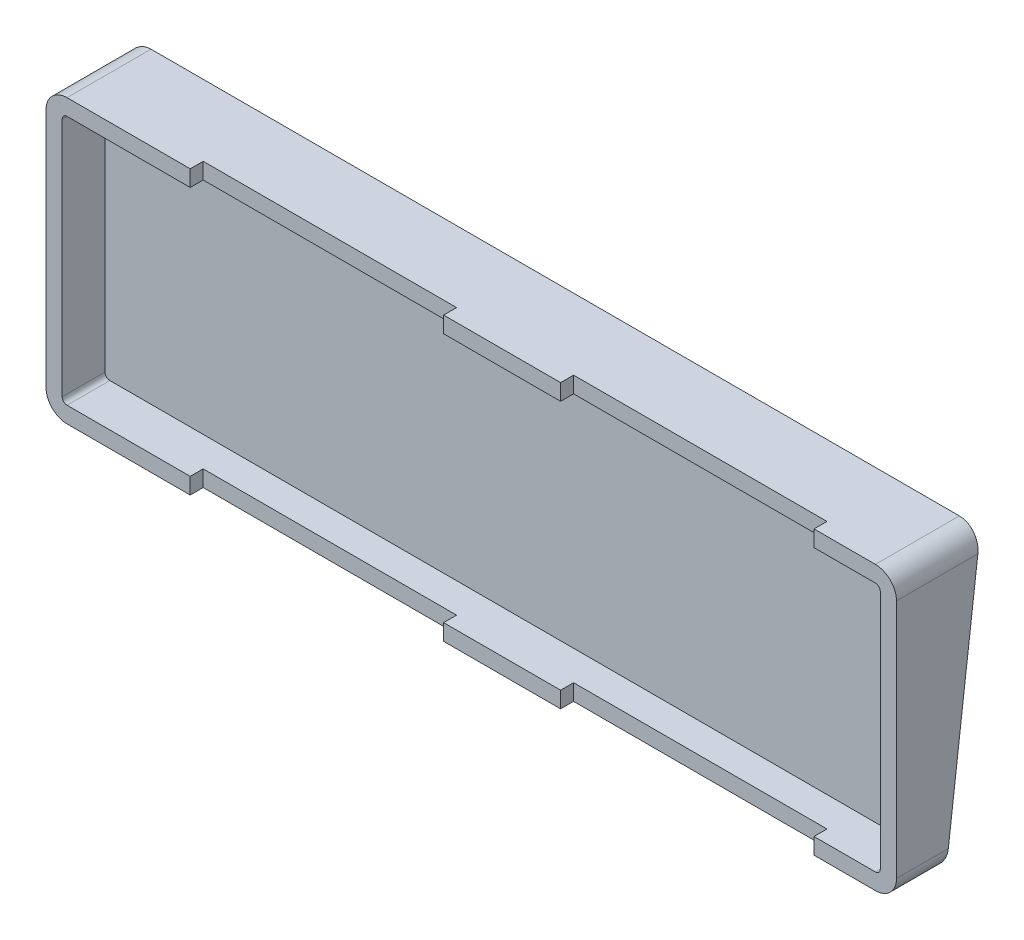
ISO-10303-21;
HEADER;
FILE_DESCRIPTION(('STEP AP214'),'2;1');
FILE_NAME('part.step','',(''),(''),'','','');
FILE_SCHEMA(('AUTOMOTIVE_DESIGN { 1 0 10303 214 1 1 1 1 }'));
ENDSEC;
DATA;
#1=APPLICATION_CONTEXT('core data for automotive mechanical design processes');
#2=APPLICATION_PROTOCOL_DEFINITION('international standard','automotive_design',2000,#1);
#3=PRODUCT_CONTEXT('',#1,'mechanical');
#4=PRODUCT('Part','Part','',(#3));
#5=PRODUCT_RELATED_PRODUCT_CATEGORY('part','',(#4));
#6=PRODUCT_DEFINITION_FORMATION('','',#4);
#7=PRODUCT_DEFINITION_CONTEXT('part definition',#1,'design');
#8=PRODUCT_DEFINITION('design','',#6,#7);
#9=PRODUCT_DEFINITION_SHAPE('','',#8);
#10=(LENGTH_UNIT() NAMED_UNIT(*) SI_UNIT(.MILLI.,.METRE.));
#11=(NAMED_UNIT(*) PLANE_ANGLE_UNIT() SI_UNIT($,.RADIAN.));
#12=(NAMED_UNIT(*) SI_UNIT($,.STERADIAN.) SOLID_ANGLE_UNIT());
#13=UNCERTAINTY_MEASURE_WITH_UNIT(LENGTH_MEASURE(1.E-05),#10,'distance_accuracy_value','');
#14=(GEOMETRIC_REPRESENTATION_CONTEXT(3) GLOBAL_UNCERTAINTY_ASSIGNED_CONTEXT((#13)) GLOBAL_UNIT_ASSIGNED_CONTEXT((#10,
#11,#12)) REPRESENTATION_CONTEXT('',''));
#15=CARTESIAN_POINT('',(0.,0.,0.));
#16=DIRECTION('',(0.,0.,1.));
#17=DIRECTION('',(1.,0.,0.));
#18=AXIS2_PLACEMENT_3D('',#15,#16,#17);
#19=CARTESIAN_POINT('',(280.772500000017,-126.634997509999,282.586613314107));
#20=DIRECTION('',(-1.,-2.28927396857067E-13,0.));
#21=DIRECTION('',(2.28927396857067E-13,-1.,0.));
#22=AXIS2_PLACEMENT_3D('',#19,#20,#21);
#23=PLANE('',#22);
#24=DIRECTION('',(2.27221006755748E-13,-0.992546151641322,0.121869343405148));
#25=VECTOR('',#24,1.);
#26=CARTESIAN_POINT('',(280.772500000025,-162.024507324144,-5.63781452849937));
#27=LINE('',#26,#25);
#28=CARTESIAN_POINT('',(280.7725,-52.435,-19.0937140648601));
#29=VERTEX_POINT('',#28);
#30=CARTESIAN_POINT('',(280.772500000026,-126.634997509999,-9.98309995159829));
#31=VERTEX_POINT('',#30);
#32=EDGE_CURVE('E275',#29,#31,#27,.T.);
#33=ORIENTED_EDGE('',*,*,#32,.F.);
#34=DIRECTION('',(0.,0.,-1.));
#35=VECTOR('',#34,1.);
#36=CARTESIAN_POINT('',(280.7725,-52.435,282.586613314107));
#37=LINE('',#36,#35);
#38=CARTESIAN_POINT('',(280.7725,-52.435,6.02000000000003));
#39=VERTEX_POINT('',#38);
#40=EDGE_CURVE('E262',#39,#29,#37,.T.);
#41=ORIENTED_EDGE('',*,*,#40,.F.);
#42=DIRECTION('',(-2.28927396857067E-13,1.,0.));
#43=VECTOR('',#42,1.);
#44=CARTESIAN_POINT('',(280.772500000017,-126.634997509999,6.02000000000003));
#45=LINE('',#44,#43);
#46=CARTESIAN_POINT('',(280.772500000026,-126.634997509999,6.02000000000003));
#47=VERTEX_POINT('',#46);
#48=EDGE_CURVE('E450',#47,#39,#45,.T.);
#49=ORIENTED_EDGE('',*,*,#48,.F.);
#50=DIRECTION('',(0.,0.,-1.));
#51=VECTOR('',#50,1.);
#52=CARTESIAN_POINT('',(280.772500000026,-126.634997509999,282.586613314107));
#53=LINE('',#52,#51);
#54=EDGE_CURVE('E271',#47,#31,#53,.T.);
#55=ORIENTED_EDGE('',*,*,#54,.T.);
#56=EDGE_LOOP('',(#33,#41,#49,#55));
#57=FACE_BOUND('',#56,.T.);
#58=ADVANCED_FACE('F50',(#57),#23,.F.);
#59=CARTESIAN_POINT('',(274.27250074707,-126.635000747,282.586613314107));
#60=DIRECTION('',(0.,0.,-1.));
#61=DIRECTION('',(-1.,0.,0.));
#62=AXIS2_PLACEMENT_3D('',#59,#60,#61);
#63=CYLINDRICAL_SURFACE('',#62,6.49999925295641);
#64=CARTESIAN_POINT('',(274.27250074707,-126.635000747,-9.98309955414456));
#65=DIRECTION('',(0.,-0.121869343405148,-0.992546151641322));
#66=DIRECTION('',(0.,0.992546151641322,-0.121869343405148));
#67=AXIS2_PLACEMENT_3D('',#64,#65,#66);
#68=ELLIPSE('',#67,6.54881311282875,6.49999925295641);
#69=CARTESIAN_POINT('',(274.2725,-133.134999999965,-9.18499999999939));
#70=VERTEX_POINT('',#69);
#71=EDGE_CURVE('E65',#31,#70,#68,.T.);
#72=ORIENTED_EDGE('',*,*,#71,.F.);
#73=ORIENTED_EDGE('',*,*,#54,.F.);
#74=CARTESIAN_POINT('',(274.27250074707,-126.635000747,6.02000000000003));
#75=DIRECTION('',(0.,0.,1.));
#76=DIRECTION('',(1.,0.,0.));
#77=AXIS2_PLACEMENT_3D('',#74,#75,#76);
#78=CIRCLE('',#77,6.49999925295641);
#79=CARTESIAN_POINT('',(274.2725,-133.134999999965,6.02000000000003));
#80=VERTEX_POINT('',#79);
#81=EDGE_CURVE('E452',#80,#47,#78,.T.);
#82=ORIENTED_EDGE('',*,*,#81,.F.);
#83=DIRECTION('',(0.,0.,-1.));
#84=VECTOR('',#83,1.);
#85=CARTESIAN_POINT('',(274.2725,-133.134999999965,282.586613314107));
#86=LINE('',#85,#84);
#87=EDGE_CURVE('E499',#80,#70,#86,.T.);
#88=ORIENTED_EDGE('',*,*,#87,.T.);
#89=EDGE_LOOP('',(#72,#73,#82,#88));
#90=FACE_BOUND('',#89,.T.);
#91=ADVANCED_FACE('F586',(#90),#63,.T.);
#92=CARTESIAN_POINT('',(24.8125041089156,-133.13499999998,282.586613314107));
#93=DIRECTION('',(0.,1.,0.));
#94=DIRECTION('',(-1.,0.,0.));
#95=AXIS2_PLACEMENT_3D('',#92,#93,#94);
#96=PLANE('',#95);
#97=DIRECTION('',(-1.,0.,0.));
#98=VECTOR('',#97,1.);
#99=CARTESIAN_POINT('',(24.8125041089142,-133.13499999998,-9.18499999999883));
#100=LINE('',#99,#98);
#101=CARTESIAN_POINT('',(24.8125041089156,-133.13499999997,-9.185));
#102=VERTEX_POINT('',#101);
#103=EDGE_CURVE('E73',#70,#102,#100,.T.);
#104=ORIENTED_EDGE('',*,*,#103,.F.);
#105=ORIENTED_EDGE('',*,*,#87,.F.);
#106=DIRECTION('',(1.,0.,0.));
#107=VECTOR('',#106,1.);
#108=CARTESIAN_POINT('',(24.8125041089156,-133.13499999998,6.02000000000003));
#109=LINE('',#108,#107);
#110=CARTESIAN_POINT('',(255.3175,-133.134999999966,6.02000000000003));
#111=VERTEX_POINT('',#110);
#112=EDGE_CURVE('E455',#111,#80,#109,.T.);
#113=ORIENTED_EDGE('',*,*,#112,.F.);
#114=DIRECTION('',(0.,0.,1.));
#115=VECTOR('',#114,1.);
#116=CARTESIAN_POINT('',(255.3175,-133.13499999997,2.02));
#117=LINE('',#116,#115);
#118=CARTESIAN_POINT('',(255.3175,-133.13499999997,2.02));
#119=VERTEX_POINT('',#118);
#120=EDGE_CURVE('E350',#119,#111,#117,.T.);
#121=ORIENTED_EDGE('',*,*,#120,.F.);
#122=DIRECTION('',(1.,0.,0.));
#123=VECTOR('',#122,1.);
#124=CARTESIAN_POINT('',(177.1175,-133.13499999997,2.02));
#125=LINE('',#124,#123);
#126=CARTESIAN_POINT('',(177.1175,-133.13499999997,2.02));
#127=VERTEX_POINT('',#126);
#128=EDGE_CURVE('E369',#127,#119,#125,.T.);
#129=ORIENTED_EDGE('',*,*,#128,.F.);
#130=DIRECTION('',(0.,0.,1.));
#131=VECTOR('',#130,1.);
#132=CARTESIAN_POINT('',(177.1175,-133.13499999997,2.02));
#133=LINE('',#132,#131);
#134=CARTESIAN_POINT('',(177.1175,-133.13499999997,6.02));
#135=VERTEX_POINT('',#134);
#136=EDGE_CURVE('E346',#127,#135,#133,.T.);
#137=ORIENTED_EDGE('',*,*,#136,.T.);
#138=CARTESIAN_POINT('',(141.0175,-133.134999999973,6.02000000000003));
#139=VERTEX_POINT('',#138);
#140=EDGE_CURVE('E460',#139,#135,#109,.T.);
#141=ORIENTED_EDGE('',*,*,#140,.F.);
#142=DIRECTION('',(0.,0.,1.));
#143=VECTOR('',#142,1.);
#144=CARTESIAN_POINT('',(141.0175,-133.13499999997,2.02));
#145=LINE('',#144,#143);
#146=CARTESIAN_POINT('',(141.0175,-133.13499999997,2.02));
#147=VERTEX_POINT('',#146);
#148=EDGE_CURVE('E424',#147,#139,#145,.T.);
#149=ORIENTED_EDGE('',*,*,#148,.F.);
#150=DIRECTION('',(1.,0.,0.));
#151=VECTOR('',#150,1.);
#152=CARTESIAN_POINT('',(62.8175,-133.13499999997,2.02));
#153=LINE('',#152,#151);
#154=CARTESIAN_POINT('',(62.8175,-133.13499999997,2.02));
#155=VERTEX_POINT('',#154);
#156=EDGE_CURVE('E405',#155,#147,#153,.T.);
#157=ORIENTED_EDGE('',*,*,#156,.F.);
#158=DIRECTION('',(0.,0.,1.));
#159=VECTOR('',#158,1.);
#160=CARTESIAN_POINT('',(62.8175,-133.13499999997,2.02));
#161=LINE('',#160,#159);
#162=CARTESIAN_POINT('',(62.8175,-133.13499999997,6.02));
#163=VERTEX_POINT('',#162);
#164=EDGE_CURVE('E415',#155,#163,#161,.T.);
#165=ORIENTED_EDGE('',*,*,#164,.T.);
#166=CARTESIAN_POINT('',(24.8125041089156,-133.13499999997,6.02000000000003));
#167=VERTEX_POINT('',#166);
#168=EDGE_CURVE('E456',#167,#163,#109,.T.);
#169=ORIENTED_EDGE('',*,*,#168,.F.);
#170=DIRECTION('',(0.,0.,-1.));
#171=VECTOR('',#170,1.);
#172=CARTESIAN_POINT('',(24.8125041089156,-133.13499999997,282.586613314107));
#173=LINE('',#172,#171);
#174=EDGE_CURVE('E501',#167,#102,#173,.T.);
#175=ORIENTED_EDGE('',*,*,#174,.T.);
#176=EDGE_LOOP('',(#104,#105,#113,#121,#129,#137,#141,#149,#157,#165,#169,#175));
#177=FACE_BOUND('',#176,.T.);
#178=ADVANCED_FACE('F561',(#177),#96,.F.);
#179=CARTESIAN_POINT('',(24.812499252925,-126.635000747,282.586613314107));
#180=DIRECTION('',(0.,0.,-1.));
#181=DIRECTION('',(-1.,0.,0.));
#182=AXIS2_PLACEMENT_3D('',#179,#180,#181);
#183=CYLINDRICAL_SURFACE('',#182,6.49999925297202);
#184=CARTESIAN_POINT('',(24.812499252925,-126.635000747,-9.98309955414517));
#185=DIRECTION('',(0.,-0.121869343405148,-0.992546151641322));
#186=DIRECTION('',(0.,0.992546151641322,-0.121869343405148));
#187=AXIS2_PLACEMENT_3D('',#184,#185,#186);
#188=ELLIPSE('',#187,6.54881311284448,6.49999925297202);
#189=CARTESIAN_POINT('',(18.3124999999625,-126.635,-9.98309964586519));
#190=VERTEX_POINT('',#189);
#191=EDGE_CURVE('E293',#102,#190,#188,.T.);
#192=ORIENTED_EDGE('',*,*,#191,.F.);
#193=ORIENTED_EDGE('',*,*,#174,.F.);
#194=CARTESIAN_POINT('',(24.812499252925,-126.635000747,6.02000000000003));
#195=DIRECTION('',(0.,0.,1.));
#196=DIRECTION('',(1.,0.,0.));
#197=AXIS2_PLACEMENT_3D('',#194,#195,#196);
#198=CIRCLE('',#197,6.49999925297202);
#199=CARTESIAN_POINT('',(18.3124999999625,-126.635,6.02000000000003));
#200=VERTEX_POINT('',#199);
#201=EDGE_CURVE('E459',#200,#167,#198,.T.);
#202=ORIENTED_EDGE('',*,*,#201,.F.);
#203=DIRECTION('',(0.,0.,-1.));
#204=VECTOR('',#203,1.);
#205=CARTESIAN_POINT('',(18.3124999999625,-126.635,282.586613314107));
#206=LINE('',#205,#204);
#207=EDGE_CURVE('E503',#200,#190,#206,.T.);
#208=ORIENTED_EDGE('',*,*,#207,.T.);
#209=EDGE_LOOP('',(#192,#193,#202,#208));
#210=FACE_BOUND('',#209,.T.);
#211=ADVANCED_FACE('F588',(#210),#183,.T.);
#212=CARTESIAN_POINT('',(18.312500000004,-52.4350041089431,282.586613314107));
#213=DIRECTION('',(1.,-5.59834105876915E-13,0.));
#214=DIRECTION('',(5.59834105876915E-13,1.,0.));
#215=AXIS2_PLACEMENT_3D('',#212,#213,#214);
#216=PLANE('',#215);
#217=DIRECTION('',(5.55661187345693E-13,0.992546151641322,-0.121869343405148));
#218=VECTOR('',#217,1.);
#219=CARTESIAN_POINT('',(18.3124999999836,-88.9265423802406,-14.6131160570331));
#220=LINE('',#219,#218);
#221=CARTESIAN_POINT('',(18.3125000000054,-52.4350041089431,-19.093713560346));
#222=VERTEX_POINT('',#221);
#223=EDGE_CURVE('E289',#190,#222,#220,.T.);
#224=ORIENTED_EDGE('',*,*,#223,.F.);
#225=ORIENTED_EDGE('',*,*,#207,.F.);
#226=DIRECTION('',(-5.59834105876915E-13,-1.,0.));
#227=VECTOR('',#226,1.);
#228=CARTESIAN_POINT('',(18.312500000004,-52.4350041089431,6.02000000000003));
#229=LINE('',#228,#227);
#230=CARTESIAN_POINT('',(18.3125000000054,-52.4350041089431,6.02000000000003));
#231=VERTEX_POINT('',#230);
#232=EDGE_CURVE('E463',#231,#200,#229,.T.);
#233=ORIENTED_EDGE('',*,*,#232,.F.);
#234=DIRECTION('',(0.,0.,-1.));
#235=VECTOR('',#234,1.);
#236=CARTESIAN_POINT('',(18.3125000000054,-52.4350041089431,282.586613314107));
#237=LINE('',#236,#235);
#238=EDGE_CURVE('E506',#231,#222,#237,.T.);
#239=ORIENTED_EDGE('',*,*,#238,.T.);
#240=EDGE_LOOP('',(#224,#225,#233,#239));
#241=FACE_BOUND('',#240,.T.);
#242=ADVANCED_FACE('F591',(#241),#216,.F.);
#243=CARTESIAN_POINT('',(24.812499252925,-52.43499925292,282.586613314107));
#244=DIRECTION('',(0.,0.,-1.));
#245=DIRECTION('',(-1.,0.,0.));
#246=AXIS2_PLACEMENT_3D('',#243,#244,#245);
#247=CYLINDRICAL_SURFACE('',#246,6.49999925292141);
#248=CARTESIAN_POINT('',(24.812499252925,-52.43499925292,-19.0937141565906));
#249=DIRECTION('',(0.,-0.121869343405148,-0.992546151641322));
#250=DIRECTION('',(0.,0.992546151641322,-0.121869343405148));
#251=AXIS2_PLACEMENT_3D('',#248,#249,#250);
#252=ELLIPSE('',#251,6.54881311279349,6.49999925292141);
#253=CARTESIAN_POINT('',(24.8125,-45.935,-19.8918137107293));
#254=VERTEX_POINT('',#253);
#255=EDGE_CURVE('E284',#222,#254,#252,.T.);
#256=ORIENTED_EDGE('',*,*,#255,.F.);
#257=ORIENTED_EDGE('',*,*,#238,.F.);
#258=CARTESIAN_POINT('',(24.812499252925,-52.43499925292,6.02000000000003));
#259=DIRECTION('',(0.,0.,1.));
#260=DIRECTION('',(1.,0.,0.));
#261=AXIS2_PLACEMENT_3D('',#258,#259,#260);
#262=CIRCLE('',#261,6.49999925292141);
#263=CARTESIAN_POINT('',(24.8125,-45.935,6.02000000000003));
#264=VERTEX_POINT('',#263);
#265=EDGE_CURVE('E466',#264,#231,#262,.T.);
#266=ORIENTED_EDGE('',*,*,#265,.F.);
#267=DIRECTION('',(0.,0.,-1.));
#268=VECTOR('',#267,1.);
#269=CARTESIAN_POINT('',(24.8125,-45.935,282.586613314107));
#270=LINE('',#269,#268);
#271=EDGE_CURVE('E509',#264,#254,#270,.T.);
#272=ORIENTED_EDGE('',*,*,#271,.T.);
#273=EDGE_LOOP('',(#256,#257,#266,#272));
#274=FACE_BOUND('',#273,.T.);
#275=ADVANCED_FACE('F596',(#274),#247,.T.);
#276=CARTESIAN_POINT('',(274.272499626465,-45.935,282.586613314107));
#277=DIRECTION('',(0.,-1.,0.));
#278=DIRECTION('',(1.,0.,0.));
#279=AXIS2_PLACEMENT_3D('',#276,#277,#278);
#280=PLANE('',#279);
#281=DIRECTION('',(1.,0.,0.));
#282=VECTOR('',#281,1.);
#283=CARTESIAN_POINT('',(274.272499626465,-45.935,-19.891813710729));
#284=LINE('',#283,#282);
#285=CARTESIAN_POINT('',(274.272499626465,-45.935,-19.891813710729));
#286=VERTEX_POINT('',#285);
#287=EDGE_CURVE('E282',#254,#286,#284,.T.);
#288=ORIENTED_EDGE('',*,*,#287,.F.);
#289=ORIENTED_EDGE('',*,*,#271,.F.);
#290=DIRECTION('',(-1.,0.,0.));
#291=VECTOR('',#290,1.);
#292=CARTESIAN_POINT('',(274.272499626465,-45.935,6.02000000000003));
#293=LINE('',#292,#291);
#294=CARTESIAN_POINT('',(62.8175,-45.935,6.02));
#295=VERTEX_POINT('',#294);
#296=EDGE_CURVE('E469',#295,#264,#293,.T.);
#297=ORIENTED_EDGE('',*,*,#296,.F.);
#298=DIRECTION('',(0.,0.,1.));
#299=VECTOR('',#298,1.);
#300=CARTESIAN_POINT('',(62.8175,-45.935,2.02));
#301=LINE('',#300,#299);
#302=CARTESIAN_POINT('',(62.8175,-45.935,2.02));
#303=VERTEX_POINT('',#302);
#304=EDGE_CURVE('E335',#303,#295,#301,.T.);
#305=ORIENTED_EDGE('',*,*,#304,.F.);
#306=DIRECTION('',(-1.,0.,0.));
#307=VECTOR('',#306,1.);
#308=CARTESIAN_POINT('',(62.8175,-45.935,2.02));
#309=LINE('',#308,#307);
#310=CARTESIAN_POINT('',(141.0175,-45.935,2.02));
#311=VERTEX_POINT('',#310);
#312=EDGE_CURVE('E377',#311,#303,#309,.T.);
#313=ORIENTED_EDGE('',*,*,#312,.F.);
#314=DIRECTION('',(0.,0.,1.));
#315=VECTOR('',#314,1.);
#316=CARTESIAN_POINT('',(141.0175,-45.935,2.02));
#317=LINE('',#316,#315);
#318=CARTESIAN_POINT('',(141.0175,-45.935,6.02));
#319=VERTEX_POINT('',#318);
#320=EDGE_CURVE('E381',#311,#319,#317,.T.);
#321=ORIENTED_EDGE('',*,*,#320,.T.);
#322=CARTESIAN_POINT('',(177.1175,-45.935,6.02));
#323=VERTEX_POINT('',#322);
#324=EDGE_CURVE('E473',#323,#319,#293,.T.);
#325=ORIENTED_EDGE('',*,*,#324,.F.);
#326=DIRECTION('',(0.,0.,1.));
#327=VECTOR('',#326,1.);
#328=CARTESIAN_POINT('',(177.1175,-45.935,2.02));
#329=LINE('',#328,#327);
#330=CARTESIAN_POINT('',(177.1175,-45.935,2.02));
#331=VERTEX_POINT('',#330);
#332=EDGE_CURVE('E319',#331,#323,#329,.T.);
#333=ORIENTED_EDGE('',*,*,#332,.F.);
#334=DIRECTION('',(-1.,0.,0.));
#335=VECTOR('',#334,1.);
#336=CARTESIAN_POINT('',(177.1175,-45.935,2.02));
#337=LINE('',#336,#335);
#338=CARTESIAN_POINT('',(255.3175,-45.935,2.02));
#339=VERTEX_POINT('',#338);
#340=EDGE_CURVE('E323',#339,#331,#337,.T.);
#341=ORIENTED_EDGE('',*,*,#340,.F.);
#342=DIRECTION('',(0.,0.,1.));
#343=VECTOR('',#342,1.);
#344=CARTESIAN_POINT('',(255.3175,-45.935,2.02));
#345=LINE('',#344,#343);
#346=CARTESIAN_POINT('',(255.3175,-45.935,6.02));
#347=VERTEX_POINT('',#346);
#348=EDGE_CURVE('E326',#339,#347,#345,.T.);
#349=ORIENTED_EDGE('',*,*,#348,.T.);
#350=CARTESIAN_POINT('',(274.272499626465,-45.935,6.02000000000003));
#351=VERTEX_POINT('',#350);
#352=EDGE_CURVE('E470',#351,#347,#293,.T.);
#353=ORIENTED_EDGE('',*,*,#352,.F.);
#354=DIRECTION('',(0.,0.,-1.));
#355=VECTOR('',#354,1.);
#356=CARTESIAN_POINT('',(274.272499626465,-45.935,282.586613314107));
#357=LINE('',#356,#355);
#358=EDGE_CURVE('E511',#351,#286,#357,.T.);
#359=ORIENTED_EDGE('',*,*,#358,.T.);
#360=EDGE_LOOP('',(#288,#289,#297,#305,#313,#321,#325,#333,#341,#349,#353,#359));
#361=FACE_BOUND('',#360,.T.);
#362=ADVANCED_FACE('F597',(#361),#280,.F.);
#363=CARTESIAN_POINT('',(274.27250074707,-52.43499925292,282.586613314107));
#364=DIRECTION('',(0.,0.,-1.));
#365=DIRECTION('',(-1.,0.,0.));
#366=AXIS2_PLACEMENT_3D('',#363,#364,#365);
#367=CYLINDRICAL_SURFACE('',#366,6.49999925292508);
#368=CARTESIAN_POINT('',(274.27250074707,-52.43499925292,-19.09371415659));
#369=DIRECTION('',(0.,-0.121869343405148,-0.992546151641322));
#370=DIRECTION('',(0.,0.992546151641322,-0.121869343405148));
#371=AXIS2_PLACEMENT_3D('',#368,#369,#370);
#372=ELLIPSE('',#371,6.5488131127972,6.49999925292508);
#373=EDGE_CURVE('E13',#286,#29,#372,.T.);
#374=ORIENTED_EDGE('',*,*,#373,.F.);
#375=ORIENTED_EDGE('',*,*,#358,.F.);
#376=CARTESIAN_POINT('',(274.27250074707,-52.43499925292,6.02000000000003));
#377=DIRECTION('',(0.,0.,1.));
#378=DIRECTION('',(1.,0.,0.));
#379=AXIS2_PLACEMENT_3D('',#376,#377,#378);
#380=CIRCLE('',#379,6.49999925292508);
#381=EDGE_CURVE('E267',#39,#351,#380,.T.);
#382=ORIENTED_EDGE('',*,*,#381,.F.);
#383=ORIENTED_EDGE('',*,*,#40,.T.);
#384=EDGE_LOOP('',(#374,#375,#382,#383));
#385=FACE_BOUND('',#384,.T.);
#386=ADVANCED_FACE('F52',(#385),#367,.T.);
#387=CARTESIAN_POINT('',(24.8125003735378,-128.134999999981,282.586613314107));
#388=DIRECTION('',(0.,1.,0.));
#389=DIRECTION('',(-1.,0.,0.));
#390=AXIS2_PLACEMENT_3D('',#387,#388,#389);
#391=PLANE('',#390);
#392=DIRECTION('',(0.,0.,-1.));
#393=VECTOR('',#392,1.);
#394=CARTESIAN_POINT('',(274.2725,-128.134999999965,282.586613314107));
#395=LINE('',#394,#393);
#396=CARTESIAN_POINT('',(274.2725,-128.134999999965,6.02000000000003));
#397=VERTEX_POINT('',#396);
#398=CARTESIAN_POINT('',(274.2725,-128.134999999965,-7.185));
#399=VERTEX_POINT('',#398);
#400=EDGE_CURVE('E475',#397,#399,#395,.T.);
#401=ORIENTED_EDGE('',*,*,#400,.T.);
#402=DIRECTION('',(-1.,0.,0.));
#403=VECTOR('',#402,1.);
#404=CARTESIAN_POINT('',(24.8125003735378,-128.134999999981,-7.185));
#405=LINE('',#404,#403);
#406=CARTESIAN_POINT('',(24.8125003735378,-128.134999999972,-7.185));
#407=VERTEX_POINT('',#406);
#408=EDGE_CURVE('E316',#399,#407,#405,.T.);
#409=ORIENTED_EDGE('',*,*,#408,.T.);
#410=DIRECTION('',(0.,0.,-1.));
#411=VECTOR('',#410,1.);
#412=CARTESIAN_POINT('',(24.8125003735378,-128.134999999972,282.586613314107));
#413=LINE('',#412,#411);
#414=CARTESIAN_POINT('',(24.8125003735378,-128.134999999981,6.02000000000003));
#415=VERTEX_POINT('',#414);
#416=EDGE_CURVE('E478',#415,#407,#413,.T.);
#417=ORIENTED_EDGE('',*,*,#416,.F.);
#418=DIRECTION('',(1.,0.,0.));
#419=VECTOR('',#418,1.);
#420=CARTESIAN_POINT('',(24.8125003735378,-128.134999999981,6.02000000000003));
#421=LINE('',#420,#419);
#422=CARTESIAN_POINT('',(62.8175,-128.134999999981,6.02));
#423=VERTEX_POINT('',#422);
#424=EDGE_CURVE('E514',#415,#423,#421,.T.);
#425=ORIENTED_EDGE('',*,*,#424,.T.);
#426=DIRECTION('',(0.,0.,1.));
#427=VECTOR('',#426,1.);
#428=CARTESIAN_POINT('',(62.8175,-128.134999999981,2.02));
#429=LINE('',#428,#427);
#430=CARTESIAN_POINT('',(62.8175,-128.134999999981,2.02));
#431=VERTEX_POINT('',#430);
#432=EDGE_CURVE('E418',#431,#423,#429,.T.);
#433=ORIENTED_EDGE('',*,*,#432,.F.);
#434=DIRECTION('',(-1.,0.,0.));
#435=VECTOR('',#434,1.);
#436=CARTESIAN_POINT('',(62.8175,-128.134999999981,2.02));
#437=LINE('',#436,#435);
#438=CARTESIAN_POINT('',(141.0175,-128.134999999981,2.02));
#439=VERTEX_POINT('',#438);
#440=EDGE_CURVE('E412',#439,#431,#437,.T.);
#441=ORIENTED_EDGE('',*,*,#440,.F.);
#442=DIRECTION('',(0.,0.,1.));
#443=VECTOR('',#442,1.);
#444=CARTESIAN_POINT('',(141.0175,-128.134999999981,2.02));
#445=LINE('',#444,#443);
#446=CARTESIAN_POINT('',(141.0175,-128.134999999981,6.02));
#447=VERTEX_POINT('',#446);
#448=EDGE_CURVE('E421',#439,#447,#445,.T.);
#449=ORIENTED_EDGE('',*,*,#448,.T.);
#450=CARTESIAN_POINT('',(177.1175,-128.134999999981,6.02));
#451=VERTEX_POINT('',#450);
#452=EDGE_CURVE('E516',#447,#451,#421,.T.);
#453=ORIENTED_EDGE('',*,*,#452,.T.);
#454=DIRECTION('',(0.,0.,1.));
#455=VECTOR('',#454,1.);
#456=CARTESIAN_POINT('',(177.1175,-128.134999999981,2.02));
#457=LINE('',#456,#455);
#458=CARTESIAN_POINT('',(177.1175,-128.134999999981,2.02));
#459=VERTEX_POINT('',#458);
#460=EDGE_CURVE('E355',#459,#451,#457,.T.);
#461=ORIENTED_EDGE('',*,*,#460,.F.);
#462=DIRECTION('',(-1.,0.,0.));
#463=VECTOR('',#462,1.);
#464=CARTESIAN_POINT('',(177.1175,-128.134999999981,2.02));
#465=LINE('',#464,#463);
#466=CARTESIAN_POINT('',(255.3175,-128.134999999981,2.02));
#467=VERTEX_POINT('',#466);
#468=EDGE_CURVE('E349',#467,#459,#465,.T.);
#469=ORIENTED_EDGE('',*,*,#468,.F.);
#470=DIRECTION('',(0.,0.,1.));
#471=VECTOR('',#470,1.);
#472=CARTESIAN_POINT('',(255.3175,-128.134999999981,2.02));
#473=LINE('',#472,#471);
#474=CARTESIAN_POINT('',(255.3175,-128.134999999981,6.02));
#475=VERTEX_POINT('',#474);
#476=EDGE_CURVE('E352',#467,#475,#473,.T.);
#477=ORIENTED_EDGE('',*,*,#476,.T.);
#478=EDGE_CURVE('E513',#475,#397,#421,.T.);
#479=ORIENTED_EDGE('',*,*,#478,.T.);
#480=EDGE_LOOP('',(#401,#409,#417,#425,#433,#441,#449,#453,#461,#469,#477,#479));
#481=FACE_BOUND('',#480,.T.);
#482=ADVANCED_FACE('F524',(#481),#391,.T.);
#483=CARTESIAN_POINT('',(24.812499252925,-126.635000747,282.586613314107));
#484=DIRECTION('',(0.,0.,-1.));
#485=DIRECTION('',(-1.,0.,0.));
#486=AXIS2_PLACEMENT_3D('',#483,#484,#485);
#487=CYLINDRICAL_SURFACE('',#486,1.49999925297211);
#488=ORIENTED_EDGE('',*,*,#416,.T.);
#489=CARTESIAN_POINT('',(24.812499252925,-126.635000747,-7.185));
#490=DIRECTION('',(0.,0.,-1.));
#491=DIRECTION('',(0.,1.,0.));
#492=AXIS2_PLACEMENT_3D('',#489,#490,#491);
#493=CIRCLE('',#492,1.49999925297211);
#494=CARTESIAN_POINT('',(23.3124999999625,-126.635,-7.185));
#495=VERTEX_POINT('',#494);
#496=EDGE_CURVE('E313',#407,#495,#493,.T.);
#497=ORIENTED_EDGE('',*,*,#496,.T.);
#498=DIRECTION('',(0.,0.,-1.));
#499=VECTOR('',#498,1.);
#500=CARTESIAN_POINT('',(23.3124999999625,-126.635,282.586613314107));
#501=LINE('',#500,#499);
#502=CARTESIAN_POINT('',(23.3124999999531,-126.635,6.02000000000003));
#503=VERTEX_POINT('',#502);
#504=EDGE_CURVE('E481',#503,#495,#501,.T.);
#505=ORIENTED_EDGE('',*,*,#504,.F.);
#506=CARTESIAN_POINT('',(24.812499252925,-126.635000747,6.02000000000003));
#507=DIRECTION('',(0.,0.,1.));
#508=DIRECTION('',(1.,0.,0.));
#509=AXIS2_PLACEMENT_3D('',#506,#507,#508);
#510=CIRCLE('',#509,1.49999925297211);
#511=EDGE_CURVE('E420',#503,#415,#510,.T.);
#512=ORIENTED_EDGE('',*,*,#511,.T.);
#513=EDGE_LOOP('',(#488,#497,#505,#512));
#514=FACE_BOUND('',#513,.T.);
#515=ADVANCED_FACE('F551',(#514),#487,.F.);
#516=CARTESIAN_POINT('',(23.3125000000026,-52.4350003735403,282.586613314107));
#517=DIRECTION('',(1.,-5.4099058539333E-13,0.));
#518=DIRECTION('',(5.4099058539333E-13,1.,0.));
#519=AXIS2_PLACEMENT_3D('',#516,#517,#518);
#520=PLANE('',#519);
#521=ORIENTED_EDGE('',*,*,#504,.T.);
#522=DIRECTION('',(5.4099058539333E-13,1.,0.));
#523=VECTOR('',#522,1.);
#524=CARTESIAN_POINT('',(23.3125000000026,-52.4350003735402,-7.185));
#525=LINE('',#524,#523);
#526=CARTESIAN_POINT('',(23.3125000000039,-52.4350003735403,-7.185));
#527=VERTEX_POINT('',#526);
#528=EDGE_CURVE('E310',#495,#527,#525,.T.);
#529=ORIENTED_EDGE('',*,*,#528,.T.);
#530=DIRECTION('',(0.,0.,-1.));
#531=VECTOR('',#530,1.);
#532=CARTESIAN_POINT('',(23.3125000000039,-52.4350003735403,282.586613314107));
#533=LINE('',#532,#531);
#534=CARTESIAN_POINT('',(23.3125000000026,-52.4350003735403,6.02000000000003));
#535=VERTEX_POINT('',#534);
#536=EDGE_CURVE('E484',#535,#527,#533,.T.);
#537=ORIENTED_EDGE('',*,*,#536,.F.);
#538=DIRECTION('',(-5.4099058539333E-13,-1.,0.));
#539=VECTOR('',#538,1.);
#540=CARTESIAN_POINT('',(23.3125000000026,-52.4350003735403,6.02000000000003));
#541=LINE('',#540,#539);
#542=EDGE_CURVE('E430',#535,#503,#541,.T.);
#543=ORIENTED_EDGE('',*,*,#542,.T.);
#544=EDGE_LOOP('',(#521,#529,#537,#543));
#545=FACE_BOUND('',#544,.T.);
#546=ADVANCED_FACE('F548',(#545),#520,.T.);
#547=CARTESIAN_POINT('',(24.812499252925,-52.43499925292,282.586613314107));
#548=DIRECTION('',(0.,0.,-1.));
#549=DIRECTION('',(-1.,0.,0.));
#550=AXIS2_PLACEMENT_3D('',#547,#548,#549);
#551=CYLINDRICAL_SURFACE('',#550,1.49999925292148);
#552=ORIENTED_EDGE('',*,*,#536,.T.);
#553=CARTESIAN_POINT('',(24.812499252925,-52.43499925292,-7.185));
#554=DIRECTION('',(0.,0.,-1.));
#555=DIRECTION('',(0.,1.,0.));
#556=AXIS2_PLACEMENT_3D('',#553,#554,#555);
#557=CIRCLE('',#556,1.49999925292148);
#558=CARTESIAN_POINT('',(24.8125,-50.935,-7.185));
#559=VERTEX_POINT('',#558);
#560=EDGE_CURVE('E307',#527,#559,#557,.T.);
#561=ORIENTED_EDGE('',*,*,#560,.T.);
#562=DIRECTION('',(0.,0.,-1.));
#563=VECTOR('',#562,1.);
#564=CARTESIAN_POINT('',(24.8125,-50.935,282.586613314107));
#565=LINE('',#564,#563);
#566=CARTESIAN_POINT('',(24.8125,-50.9349999999987,6.02000000000003));
#567=VERTEX_POINT('',#566);
#568=EDGE_CURVE('E487',#567,#559,#565,.T.);
#569=ORIENTED_EDGE('',*,*,#568,.F.);
#570=CARTESIAN_POINT('',(24.812499252925,-52.43499925292,6.02000000000003));
#571=DIRECTION('',(0.,0.,1.));
#572=DIRECTION('',(1.,0.,0.));
#573=AXIS2_PLACEMENT_3D('',#570,#571,#572);
#574=CIRCLE('',#573,1.49999925292148);
#575=EDGE_CURVE('E433',#567,#535,#574,.T.);
#576=ORIENTED_EDGE('',*,*,#575,.T.);
#577=EDGE_LOOP('',(#552,#561,#569,#576));
#578=FACE_BOUND('',#577,.T.);
#579=ADVANCED_FACE('F544',(#578),#551,.F.);
#580=CARTESIAN_POINT('',(274.272499626465,-50.9349999999951,282.586613314107));
#581=DIRECTION('',(0.,-1.,0.));
#582=DIRECTION('',(1.,0.,0.));
#583=AXIS2_PLACEMENT_3D('',#580,#581,#582);
#584=PLANE('',#583);
#585=ORIENTED_EDGE('',*,*,#568,.T.);
#586=DIRECTION('',(1.,0.,0.));
#587=VECTOR('',#586,1.);
#588=CARTESIAN_POINT('',(274.272499626465,-50.9349999999951,-7.185));
#589=LINE('',#588,#587);
#590=CARTESIAN_POINT('',(274.27250074707,-50.9349999999923,-7.185));
#591=VERTEX_POINT('',#590);
#592=EDGE_CURVE('E303',#559,#591,#589,.T.);
#593=ORIENTED_EDGE('',*,*,#592,.T.);
#594=DIRECTION('',(0.,0.,-1.));
#595=VECTOR('',#594,1.);
#596=CARTESIAN_POINT('',(274.272499626465,-50.9349999999927,282.586613314107));
#597=LINE('',#596,#595);
#598=CARTESIAN_POINT('',(274.272499626465,-50.9349999999951,6.02000000000003));
#599=VERTEX_POINT('',#598);
#600=EDGE_CURVE('E490',#599,#591,#597,.T.);
#601=ORIENTED_EDGE('',*,*,#600,.F.);
#602=DIRECTION('',(-1.,0.,0.));
#603=VECTOR('',#602,1.);
#604=CARTESIAN_POINT('',(274.272499626465,-50.9349999999951,6.02000000000003));
#605=LINE('',#604,#603);
#606=CARTESIAN_POINT('',(255.3175,-50.9349999999955,6.02000000000003));
#607=VERTEX_POINT('',#606);
#608=EDGE_CURVE('E437',#599,#607,#605,.T.);
#609=ORIENTED_EDGE('',*,*,#608,.T.);
#610=DIRECTION('',(0.,0.,1.));
#611=VECTOR('',#610,1.);
#612=CARTESIAN_POINT('',(255.3175,-50.9349999999951,2.02));
#613=LINE('',#612,#611);
#614=CARTESIAN_POINT('',(255.3175,-50.9349999999951,2.02));
#615=VERTEX_POINT('',#614);
#616=EDGE_CURVE('E324',#615,#607,#613,.T.);
#617=ORIENTED_EDGE('',*,*,#616,.F.);
#618=DIRECTION('',(1.,0.,0.));
#619=VECTOR('',#618,1.);
#620=CARTESIAN_POINT('',(177.1175,-50.9349999999951,2.02));
#621=LINE('',#620,#619);
#622=CARTESIAN_POINT('',(177.1175,-50.9349999999951,2.02));
#623=VERTEX_POINT('',#622);
#624=EDGE_CURVE('E341',#623,#615,#621,.T.);
#625=ORIENTED_EDGE('',*,*,#624,.F.);
#626=DIRECTION('',(0.,0.,1.));
#627=VECTOR('',#626,1.);
#628=CARTESIAN_POINT('',(177.1175,-50.9349999999951,2.02));
#629=LINE('',#628,#627);
#630=CARTESIAN_POINT('',(177.1175,-50.9349999999951,6.02));
#631=VERTEX_POINT('',#630);
#632=EDGE_CURVE('E320',#623,#631,#629,.T.);
#633=ORIENTED_EDGE('',*,*,#632,.T.);
#634=CARTESIAN_POINT('',(141.0175,-50.9349999999977,6.02000000000003));
#635=VERTEX_POINT('',#634);
#636=EDGE_CURVE('E441',#631,#635,#605,.T.);
#637=ORIENTED_EDGE('',*,*,#636,.T.);
#638=DIRECTION('',(0.,0.,1.));
#639=VECTOR('',#638,1.);
#640=CARTESIAN_POINT('',(141.0175,-50.9349999999951,2.02));
#641=LINE('',#640,#639);
#642=CARTESIAN_POINT('',(141.0175,-50.9349999999951,2.02));
#643=VERTEX_POINT('',#642);
#644=EDGE_CURVE('E378',#643,#635,#641,.T.);
#645=ORIENTED_EDGE('',*,*,#644,.F.);
#646=DIRECTION('',(1.,0.,0.));
#647=VECTOR('',#646,1.);
#648=CARTESIAN_POINT('',(62.8175,-50.9349999999951,2.02));
#649=LINE('',#648,#647);
#650=CARTESIAN_POINT('',(62.8175,-50.9349999999951,2.02));
#651=VERTEX_POINT('',#650);
#652=EDGE_CURVE('E396',#651,#643,#649,.T.);
#653=ORIENTED_EDGE('',*,*,#652,.F.);
#654=DIRECTION('',(0.,0.,1.));
#655=VECTOR('',#654,1.);
#656=CARTESIAN_POINT('',(62.8175,-50.9349999999951,2.02));
#657=LINE('',#656,#655);
#658=CARTESIAN_POINT('',(62.8175,-50.9349999999951,6.02));
#659=VERTEX_POINT('',#658);
#660=EDGE_CURVE('E374',#651,#659,#657,.T.);
#661=ORIENTED_EDGE('',*,*,#660,.T.);
#662=EDGE_CURVE('E436',#659,#567,#605,.T.);
#663=ORIENTED_EDGE('',*,*,#662,.T.);
#664=EDGE_LOOP('',(#585,#593,#601,#609,#617,#625,#633,#637,#645,#653,#661,#663));
#665=FACE_BOUND('',#664,.T.);
#666=ADVANCED_FACE('F540',(#665),#584,.T.);
#667=CARTESIAN_POINT('',(274.27250074707,-52.43499925292,282.586613314107));
#668=DIRECTION('',(0.,0.,-1.));
#669=DIRECTION('',(-1.,0.,0.));
#670=AXIS2_PLACEMENT_3D('',#667,#668,#669);
#671=CYLINDRICAL_SURFACE('',#670,1.49999925292772);
#672=ORIENTED_EDGE('',*,*,#600,.T.);
#673=CARTESIAN_POINT('',(274.27250074707,-52.43499925292,-7.185));
#674=DIRECTION('',(0.,0.,-1.));
#675=DIRECTION('',(0.,1.,0.));
#676=AXIS2_PLACEMENT_3D('',#673,#674,#675);
#677=CIRCLE('',#676,1.49999925292772);
#678=CARTESIAN_POINT('',(275.7725,-52.43499925292,-7.18499999999999));
#679=VERTEX_POINT('',#678);
#680=EDGE_CURVE('E300',#591,#679,#677,.T.);
#681=ORIENTED_EDGE('',*,*,#680,.T.);
#682=DIRECTION('',(0.,0.,-1.));
#683=VECTOR('',#682,1.);
#684=CARTESIAN_POINT('',(275.7725,-52.435,282.586613314107));
#685=LINE('',#684,#683);
#686=CARTESIAN_POINT('',(275.772499999998,-52.43499925292,6.02000000000003));
#687=VERTEX_POINT('',#686);
#688=EDGE_CURVE('E493',#687,#679,#685,.T.);
#689=ORIENTED_EDGE('',*,*,#688,.F.);
#690=CARTESIAN_POINT('',(274.27250074707,-52.43499925292,6.02000000000003));
#691=DIRECTION('',(0.,0.,1.));
#692=DIRECTION('',(1.,0.,0.));
#693=AXIS2_PLACEMENT_3D('',#690,#691,#692);
#694=CIRCLE('',#693,1.49999925292772);
#695=EDGE_CURVE('E440',#687,#599,#694,.T.);
#696=ORIENTED_EDGE('',*,*,#695,.T.);
#697=EDGE_LOOP('',(#672,#681,#689,#696));
#698=FACE_BOUND('',#697,.T.);
#699=ADVANCED_FACE('F537',(#698),#671,.F.);
#700=CARTESIAN_POINT('',(275.7725,-126.635,282.586613314107));
#701=DIRECTION('',(-1.,0.,0.));
#702=DIRECTION('',(0.,0.,1.));
#703=AXIS2_PLACEMENT_3D('',#700,#701,#702);
#704=PLANE('',#703);
#705=ORIENTED_EDGE('',*,*,#688,.T.);
#706=DIRECTION('',(0.,-1.,0.));
#707=VECTOR('',#706,1.);
#708=CARTESIAN_POINT('',(275.7725,-126.635,-7.185));
#709=LINE('',#708,#707);
#710=CARTESIAN_POINT('',(275.772500000017,-126.635,-7.185));
#711=VERTEX_POINT('',#710);
#712=EDGE_CURVE('E277',#679,#711,#709,.T.);
#713=ORIENTED_EDGE('',*,*,#712,.T.);
#714=DIRECTION('',(0.,0.,-1.));
#715=VECTOR('',#714,1.);
#716=CARTESIAN_POINT('',(275.7725,-126.635,282.586613314107));
#717=LINE('',#716,#715);
#718=CARTESIAN_POINT('',(275.7725,-126.635,6.02000000000003));
#719=VERTEX_POINT('',#718);
#720=EDGE_CURVE('E272',#719,#711,#717,.T.);
#721=ORIENTED_EDGE('',*,*,#720,.F.);
#722=DIRECTION('',(0.,1.,0.));
#723=VECTOR('',#722,1.);
#724=CARTESIAN_POINT('',(275.7725,-126.635,6.02000000000003));
#725=LINE('',#724,#723);
#726=EDGE_CURVE('E444',#719,#687,#725,.T.);
#727=ORIENTED_EDGE('',*,*,#726,.T.);
#728=EDGE_LOOP('',(#705,#713,#721,#727));
#729=FACE_BOUND('',#728,.T.);
#730=ADVANCED_FACE('F534',(#729),#704,.T.);
#731=CARTESIAN_POINT('',(274.27250074707,-126.635000747,282.586613314107));
#732=DIRECTION('',(0.,0.,-1.));
#733=DIRECTION('',(-1.,0.,0.));
#734=AXIS2_PLACEMENT_3D('',#731,#732,#733);
#735=CYLINDRICAL_SURFACE('',#734,1.49999925294767);
#736=ORIENTED_EDGE('',*,*,#720,.T.);
#737=CARTESIAN_POINT('',(274.27250074707,-126.635000747,-7.185));
#738=DIRECTION('',(0.,0.,-1.));
#739=DIRECTION('',(0.,1.,0.));
#740=AXIS2_PLACEMENT_3D('',#737,#738,#739);
#741=CIRCLE('',#740,1.49999925294767);
#742=EDGE_CURVE('E58',#711,#399,#741,.T.);
#743=ORIENTED_EDGE('',*,*,#742,.T.);
#744=ORIENTED_EDGE('',*,*,#400,.F.);
#745=CARTESIAN_POINT('',(274.27250074707,-126.635000747,6.02000000000003));
#746=DIRECTION('',(0.,0.,1.));
#747=DIRECTION('',(1.,0.,0.));
#748=AXIS2_PLACEMENT_3D('',#745,#746,#747);
#749=CIRCLE('',#748,1.49999925294767);
#750=EDGE_CURVE('E447',#397,#719,#749,.T.);
#751=ORIENTED_EDGE('',*,*,#750,.T.);
#752=EDGE_LOOP('',(#736,#743,#744,#751));
#753=FACE_BOUND('',#752,.T.);
#754=ADVANCED_FACE('F520',(#753),#735,.F.);
#755=CARTESIAN_POINT('',(-5.71500000000001,15.24,6.02));
#756=DIRECTION('',(0.,0.,1.));
#757=DIRECTION('',(1.,0.,0.));
#758=AXIS2_PLACEMENT_3D('',#755,#756,#757);
#759=PLANE('',#758);
#760=DIRECTION('',(0.,-1.,0.));
#761=VECTOR('',#760,1.);
#762=CARTESIAN_POINT('',(177.1175,-128.134999999981,6.02));
#763=LINE('',#762,#761);
#764=EDGE_CURVE('E360',#451,#135,#763,.T.);
#765=ORIENTED_EDGE('',*,*,#764,.F.);
#766=ORIENTED_EDGE('',*,*,#452,.F.);
#767=DIRECTION('',(0.,1.,0.));
#768=VECTOR('',#767,1.);
#769=CARTESIAN_POINT('',(141.0175,-128.134999999981,6.02));
#770=LINE('',#769,#768);
#771=EDGE_CURVE('E406',#139,#447,#770,.T.);
#772=ORIENTED_EDGE('',*,*,#771,.F.);
#773=ORIENTED_EDGE('',*,*,#140,.T.);
#774=EDGE_LOOP('',(#765,#766,#772,#773));
#775=FACE_BOUND('',#774,.T.);
#776=ADVANCED_FACE('F574',(#775),#759,.T.);
#777=DIRECTION('',(0.,-1.,0.));
#778=VECTOR('',#777,1.);
#779=CARTESIAN_POINT('',(62.8175,-50.9349999999951,6.02));
#780=LINE('',#779,#778);
#781=EDGE_CURVE('E357',#295,#659,#780,.T.);
#782=ORIENTED_EDGE('',*,*,#781,.F.);
#783=ORIENTED_EDGE('',*,*,#296,.T.);
#784=ORIENTED_EDGE('',*,*,#265,.T.);
#785=ORIENTED_EDGE('',*,*,#232,.T.);
#786=ORIENTED_EDGE('',*,*,#201,.T.);
#787=ORIENTED_EDGE('',*,*,#168,.T.);
#788=DIRECTION('',(0.,-1.,0.));
#789=VECTOR('',#788,1.);
#790=CARTESIAN_POINT('',(62.8175,-128.134999999981,6.02));
#791=LINE('',#790,#789);
#792=EDGE_CURVE('E363',#423,#163,#791,.T.);
#793=ORIENTED_EDGE('',*,*,#792,.F.);
#794=ORIENTED_EDGE('',*,*,#424,.F.);
#795=ORIENTED_EDGE('',*,*,#511,.F.);
#796=ORIENTED_EDGE('',*,*,#542,.F.);
#797=ORIENTED_EDGE('',*,*,#575,.F.);
#798=ORIENTED_EDGE('',*,*,#662,.F.);
#799=EDGE_LOOP('',(#782,#783,#784,#785,#786,#787,#793,#794,#795,#796,#797,#798));
#800=FACE_BOUND('',#799,.T.);
#801=ADVANCED_FACE('F557',(#800),#759,.T.);
#802=DIRECTION('',(0.,1.,0.));
#803=VECTOR('',#802,1.);
#804=CARTESIAN_POINT('',(141.0175,-50.9349999999951,6.02));
#805=LINE('',#804,#803);
#806=EDGE_CURVE('E385',#635,#319,#805,.T.);
#807=ORIENTED_EDGE('',*,*,#806,.F.);
#808=ORIENTED_EDGE('',*,*,#636,.F.);
#809=DIRECTION('',(0.,-1.,0.));
#810=VECTOR('',#809,1.);
#811=CARTESIAN_POINT('',(177.1175,-50.9349999999951,6.02));
#812=LINE('',#811,#810);
#813=EDGE_CURVE('E332',#323,#631,#812,.T.);
#814=ORIENTED_EDGE('',*,*,#813,.F.);
#815=ORIENTED_EDGE('',*,*,#324,.T.);
#816=EDGE_LOOP('',(#807,#808,#814,#815));
#817=FACE_BOUND('',#816,.T.);
#818=ADVANCED_FACE('F605',(#817),#759,.T.);
#819=DIRECTION('',(0.,1.,0.));
#820=VECTOR('',#819,1.);
#821=CARTESIAN_POINT('',(255.3175,-128.134999999981,6.02));
#822=LINE('',#821,#820);
#823=EDGE_CURVE('E358',#111,#475,#822,.T.);
#824=ORIENTED_EDGE('',*,*,#823,.F.);
#825=ORIENTED_EDGE('',*,*,#112,.T.);
#826=ORIENTED_EDGE('',*,*,#81,.T.);
#827=ORIENTED_EDGE('',*,*,#48,.T.);
#828=ORIENTED_EDGE('',*,*,#381,.T.);
#829=ORIENTED_EDGE('',*,*,#352,.T.);
#830=DIRECTION('',(0.,1.,0.));
#831=VECTOR('',#830,1.);
#832=CARTESIAN_POINT('',(255.3175,-50.9349999999951,6.02));
#833=LINE('',#832,#831);
#834=EDGE_CURVE('E330',#607,#347,#833,.T.);
#835=ORIENTED_EDGE('',*,*,#834,.F.);
#836=ORIENTED_EDGE('',*,*,#608,.F.);
#837=ORIENTED_EDGE('',*,*,#695,.F.);
#838=ORIENTED_EDGE('',*,*,#726,.F.);
#839=ORIENTED_EDGE('',*,*,#750,.F.);
#840=ORIENTED_EDGE('',*,*,#478,.F.);
#841=EDGE_LOOP('',(#824,#825,#826,#827,#828,#829,#835,#836,#837,#838,#839,#840));
#842=FACE_BOUND('',#841,.T.);
#843=ADVANCED_FACE('F531',(#842),#759,.T.);
#844=CARTESIAN_POINT('',(62.8175,-128.134999999981,2.02));
#845=DIRECTION('',(-1.,0.,0.));
#846=DIRECTION('',(0.,0.,1.));
#847=AXIS2_PLACEMENT_3D('',#844,#845,#846);
#848=PLANE('',#847);
#849=ORIENTED_EDGE('',*,*,#792,.T.);
#850=ORIENTED_EDGE('',*,*,#164,.F.);
#851=DIRECTION('',(0.,-1.,0.));
#852=VECTOR('',#851,1.);
#853=CARTESIAN_POINT('',(62.8175,-128.134999999981,2.02));
#854=LINE('',#853,#852);
#855=EDGE_CURVE('E402',#431,#155,#854,.T.);
#856=ORIENTED_EDGE('',*,*,#855,.F.);
#857=ORIENTED_EDGE('',*,*,#432,.T.);
#858=EDGE_LOOP('',(#849,#850,#856,#857));
#859=FACE_BOUND('',#858,.T.);
#860=ADVANCED_FACE('F559',(#859),#848,.F.);
#861=CARTESIAN_POINT('',(141.0175,-128.134999999981,2.02));
#862=DIRECTION('',(1.,0.,0.));
#863=DIRECTION('',(0.,0.,-1.));
#864=AXIS2_PLACEMENT_3D('',#861,#862,#863);
#865=PLANE('',#864);
#866=ORIENTED_EDGE('',*,*,#771,.T.);
#867=ORIENTED_EDGE('',*,*,#448,.F.);
#868=DIRECTION('',(0.,1.,0.));
#869=VECTOR('',#868,1.);
#870=CARTESIAN_POINT('',(141.0175,-128.134999999981,2.02));
#871=LINE('',#870,#869);
#872=EDGE_CURVE('E409',#147,#439,#871,.T.);
#873=ORIENTED_EDGE('',*,*,#872,.F.);
#874=ORIENTED_EDGE('',*,*,#148,.T.);
#875=EDGE_LOOP('',(#866,#867,#873,#874));
#876=FACE_BOUND('',#875,.T.);
#877=ADVANCED_FACE('F688',(#876),#865,.F.);
#878=CARTESIAN_POINT('',(0.,0.,2.02));
#879=DIRECTION('',(0.,0.,1.));
#880=DIRECTION('',(1.,0.,0.));
#881=AXIS2_PLACEMENT_3D('',#878,#879,#880);
#882=PLANE('',#881);
#883=ORIENTED_EDGE('',*,*,#855,.T.);
#884=ORIENTED_EDGE('',*,*,#156,.T.);
#885=ORIENTED_EDGE('',*,*,#872,.T.);
#886=ORIENTED_EDGE('',*,*,#440,.T.);
#887=EDGE_LOOP('',(#883,#884,#885,#886));
#888=FACE_BOUND('',#887,.T.);
#889=ADVANCED_FACE('F566',(#888),#882,.T.);
#890=CARTESIAN_POINT('',(177.1175,-50.9349999999951,2.02));
#891=DIRECTION('',(-1.,0.,0.));
#892=DIRECTION('',(0.,0.,1.));
#893=AXIS2_PLACEMENT_3D('',#890,#891,#892);
#894=PLANE('',#893);
#895=ORIENTED_EDGE('',*,*,#813,.T.);
#896=ORIENTED_EDGE('',*,*,#632,.F.);
#897=DIRECTION('',(0.,-1.,0.));
#898=VECTOR('',#897,1.);
#899=CARTESIAN_POINT('',(177.1175,-50.9349999999951,2.02));
#900=LINE('',#899,#898);
#901=EDGE_CURVE('E333',#331,#623,#900,.T.);
#902=ORIENTED_EDGE('',*,*,#901,.F.);
#903=ORIENTED_EDGE('',*,*,#332,.T.);
#904=EDGE_LOOP('',(#895,#896,#902,#903));
#905=FACE_BOUND('',#904,.T.);
#906=ADVANCED_FACE('F726',(#905),#894,.F.);
#907=CARTESIAN_POINT('',(255.3175,-50.9349999999951,2.02));
#908=DIRECTION('',(1.,0.,0.));
#909=DIRECTION('',(0.,0.,-1.));
#910=AXIS2_PLACEMENT_3D('',#907,#908,#909);
#911=PLANE('',#910);
#912=ORIENTED_EDGE('',*,*,#834,.T.);
#913=ORIENTED_EDGE('',*,*,#348,.F.);
#914=DIRECTION('',(0.,1.,0.));
#915=VECTOR('',#914,1.);
#916=CARTESIAN_POINT('',(255.3175,-50.9349999999951,2.02));
#917=LINE('',#916,#915);
#918=EDGE_CURVE('E338',#615,#339,#917,.T.);
#919=ORIENTED_EDGE('',*,*,#918,.F.);
#920=ORIENTED_EDGE('',*,*,#616,.T.);
#921=EDGE_LOOP('',(#912,#913,#919,#920));
#922=FACE_BOUND('',#921,.T.);
#923=ADVANCED_FACE('F629',(#922),#911,.F.);
#924=CARTESIAN_POINT('',(0.,0.,2.02));
#925=DIRECTION('',(0.,0.,-1.));
#926=DIRECTION('',(-1.,0.,0.));
#927=AXIS2_PLACEMENT_3D('',#924,#925,#926);
#928=PLANE('',#927);
#929=ORIENTED_EDGE('',*,*,#901,.T.);
#930=ORIENTED_EDGE('',*,*,#624,.T.);
#931=ORIENTED_EDGE('',*,*,#918,.T.);
#932=ORIENTED_EDGE('',*,*,#340,.T.);
#933=EDGE_LOOP('',(#929,#930,#931,#932));
#934=FACE_BOUND('',#933,.T.);
#935=ADVANCED_FACE('F622',(#934),#928,.F.);
#936=CARTESIAN_POINT('',(62.8175,-50.9349999999951,2.02));
#937=DIRECTION('',(-1.,0.,0.));
#938=DIRECTION('',(0.,0.,1.));
#939=AXIS2_PLACEMENT_3D('',#936,#937,#938);
#940=PLANE('',#939);
#941=ORIENTED_EDGE('',*,*,#781,.T.);
#942=ORIENTED_EDGE('',*,*,#660,.F.);
#943=DIRECTION('',(0.,-1.,0.));
#944=VECTOR('',#943,1.);
#945=CARTESIAN_POINT('',(62.8175,-50.9349999999951,2.02));
#946=LINE('',#945,#944);
#947=EDGE_CURVE('E388',#303,#651,#946,.T.);
#948=ORIENTED_EDGE('',*,*,#947,.F.);
#949=ORIENTED_EDGE('',*,*,#304,.T.);
#950=EDGE_LOOP('',(#941,#942,#948,#949));
#951=FACE_BOUND('',#950,.T.);
#952=ADVANCED_FACE('F620',(#951),#940,.F.);
#953=CARTESIAN_POINT('',(141.0175,-50.9349999999951,2.02));
#954=DIRECTION('',(1.,0.,0.));
#955=DIRECTION('',(0.,0.,-1.));
#956=AXIS2_PLACEMENT_3D('',#953,#954,#955);
#957=PLANE('',#956);
#958=ORIENTED_EDGE('',*,*,#806,.T.);
#959=ORIENTED_EDGE('',*,*,#320,.F.);
#960=DIRECTION('',(0.,1.,0.));
#961=VECTOR('',#960,1.);
#962=CARTESIAN_POINT('',(141.0175,-50.9349999999951,2.02));
#963=LINE('',#962,#961);
#964=EDGE_CURVE('E392',#643,#311,#963,.T.);
#965=ORIENTED_EDGE('',*,*,#964,.F.);
#966=ORIENTED_EDGE('',*,*,#644,.T.);
#967=EDGE_LOOP('',(#958,#959,#965,#966));
#968=FACE_BOUND('',#967,.T.);
#969=ADVANCED_FACE('F611',(#968),#957,.F.);
#970=CARTESIAN_POINT('',(0.,0.,2.02));
#971=DIRECTION('',(0.,0.,-1.));
#972=DIRECTION('',(-1.,0.,0.));
#973=AXIS2_PLACEMENT_3D('',#970,#971,#972);
#974=PLANE('',#973);
#975=ORIENTED_EDGE('',*,*,#947,.T.);
#976=ORIENTED_EDGE('',*,*,#652,.T.);
#977=ORIENTED_EDGE('',*,*,#964,.T.);
#978=ORIENTED_EDGE('',*,*,#312,.T.);
#979=EDGE_LOOP('',(#975,#976,#977,#978));
#980=FACE_BOUND('',#979,.T.);
#981=ADVANCED_FACE('F613',(#980),#974,.F.);
#982=CARTESIAN_POINT('',(177.1175,-128.134999999981,2.02));
#983=DIRECTION('',(-1.,0.,0.));
#984=DIRECTION('',(0.,0.,1.));
#985=AXIS2_PLACEMENT_3D('',#982,#983,#984);
#986=PLANE('',#985);
#987=ORIENTED_EDGE('',*,*,#764,.T.);
#988=ORIENTED_EDGE('',*,*,#136,.F.);
#989=DIRECTION('',(0.,-1.,0.));
#990=VECTOR('',#989,1.);
#991=CARTESIAN_POINT('',(177.1175,-128.134999999981,2.02));
#992=LINE('',#991,#990);
#993=EDGE_CURVE('E361',#459,#127,#992,.T.);
#994=ORIENTED_EDGE('',*,*,#993,.F.);
#995=ORIENTED_EDGE('',*,*,#460,.T.);
#996=EDGE_LOOP('',(#987,#988,#994,#995));
#997=FACE_BOUND('',#996,.T.);
#998=ADVANCED_FACE('F577',(#997),#986,.F.);
#999=CARTESIAN_POINT('',(255.3175,-128.134999999981,2.02));
#1000=DIRECTION('',(1.,0.,0.));
#1001=DIRECTION('',(0.,0.,-1.));
#1002=AXIS2_PLACEMENT_3D('',#999,#1000,#1001);
#1003=PLANE('',#1002);
#1004=ORIENTED_EDGE('',*,*,#823,.T.);
#1005=ORIENTED_EDGE('',*,*,#476,.F.);
#1006=DIRECTION('',(0.,1.,0.));
#1007=VECTOR('',#1006,1.);
#1008=CARTESIAN_POINT('',(255.3175,-128.134999999981,2.02));
#1009=LINE('',#1008,#1007);
#1010=EDGE_CURVE('E366',#119,#467,#1009,.T.);
#1011=ORIENTED_EDGE('',*,*,#1010,.F.);
#1012=ORIENTED_EDGE('',*,*,#120,.T.);
#1013=EDGE_LOOP('',(#1004,#1005,#1011,#1012));
#1014=FACE_BOUND('',#1013,.T.);
#1015=ADVANCED_FACE('F584',(#1014),#1003,.F.);
#1016=CARTESIAN_POINT('',(0.,0.,2.02));
#1017=DIRECTION('',(0.,0.,1.));
#1018=DIRECTION('',(1.,0.,0.));
#1019=AXIS2_PLACEMENT_3D('',#1016,#1017,#1018);
#1020=PLANE('',#1019);
#1021=ORIENTED_EDGE('',*,*,#993,.T.);
#1022=ORIENTED_EDGE('',*,*,#128,.T.);
#1023=ORIENTED_EDGE('',*,*,#1010,.T.);
#1024=ORIENTED_EDGE('',*,*,#468,.T.);
#1025=EDGE_LOOP('',(#1021,#1022,#1023,#1024));
#1026=FACE_BOUND('',#1025,.T.);
#1027=ADVANCED_FACE('F582',(#1026),#1020,.T.);
#1028=CARTESIAN_POINT('',(274.27250074707,-52.43499925292,-7.185));
#1029=DIRECTION('',(0.,0.,-1.));
#1030=DIRECTION('',(0.,1.,0.));
#1031=AXIS2_PLACEMENT_3D('',#1028,#1029,#1030);
#1032=PLANE('',#1031);
#1033=ORIENTED_EDGE('',*,*,#408,.F.);
#1034=ORIENTED_EDGE('',*,*,#742,.F.);
#1035=ORIENTED_EDGE('',*,*,#712,.F.);
#1036=ORIENTED_EDGE('',*,*,#680,.F.);
#1037=ORIENTED_EDGE('',*,*,#592,.F.);
#1038=ORIENTED_EDGE('',*,*,#560,.F.);
#1039=ORIENTED_EDGE('',*,*,#528,.F.);
#1040=ORIENTED_EDGE('',*,*,#496,.F.);
#1041=EDGE_LOOP('',(#1033,#1034,#1035,#1036,#1037,#1038,#1039,#1040));
#1042=FACE_BOUND('',#1041,.T.);
#1043=ADVANCED_FACE('F535',(#1042),#1032,.F.);
#1044=CARTESIAN_POINT('',(0.,-3.08836554666365,-25.1527189082499));
#1045=DIRECTION('',(0.,-0.121869343405148,-0.992546151641322));
#1046=DIRECTION('',(0.,0.992546151641322,-0.121869343405148));
#1047=AXIS2_PLACEMENT_3D('',#1044,#1045,#1046);
#1048=PLANE('',#1047);
#1049=ORIENTED_EDGE('',*,*,#373,.T.);
#1050=ORIENTED_EDGE('',*,*,#32,.T.);
#1051=ORIENTED_EDGE('',*,*,#71,.T.);
#1052=ORIENTED_EDGE('',*,*,#103,.T.);
#1053=ORIENTED_EDGE('',*,*,#191,.T.);
#1054=ORIENTED_EDGE('',*,*,#223,.T.);
#1055=ORIENTED_EDGE('',*,*,#255,.T.);
#1056=ORIENTED_EDGE('',*,*,#287,.T.);
#1057=EDGE_LOOP('',(#1049,#1050,#1051,#1052,#1053,#1054,#1055,#1056));
#1058=FACE_BOUND('',#1057,.T.);
#1059=ADVANCED_FACE('F280',(#1058),#1048,.T.);
#1060=CLOSED_SHELL('',(#58,#91,#178,#211,#242,#275,#362,#386,#482,#515,#546,#579,#666,#699,#730,
#754,#776,#801,#818,#843,#860,#877,#889,#906,#923,#935,#952,#969,#981,#998,#1015,#1027,#1043,#1059));
#1061=MANIFOLD_SOLID_BREP('B2',#1060);
#1062=ADVANCED_BREP_SHAPE_REPRESENTATION('',(#18,#1061),#14);
#1063=SHAPE_DEFINITION_REPRESENTATION(#9,#1062);
ENDSEC;
END-ISO-10303-21;
